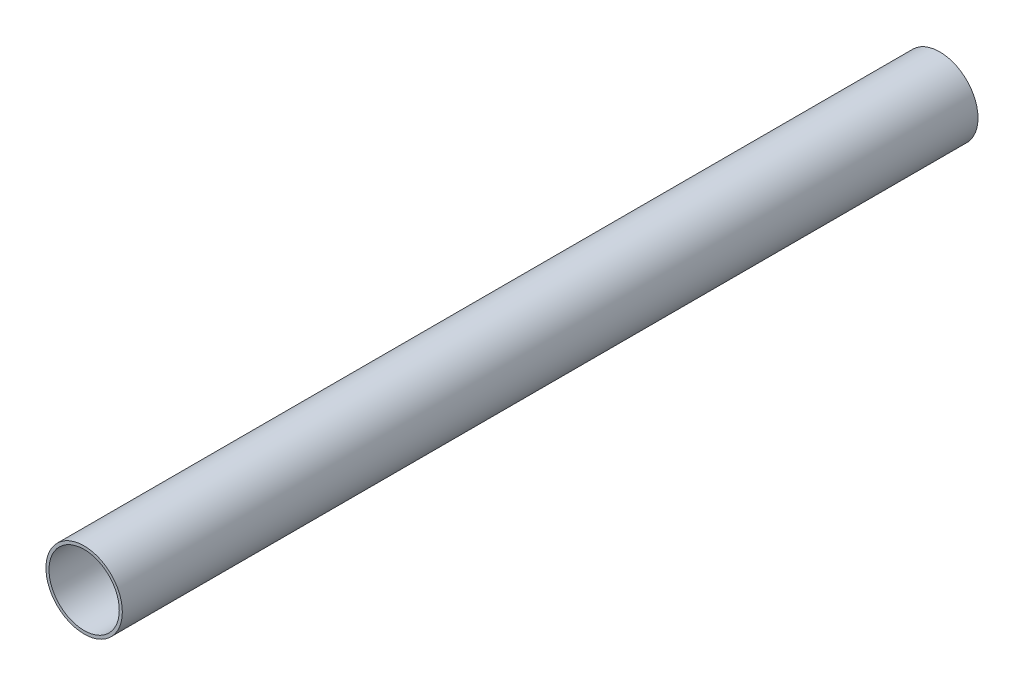
ISO-10303-21;
HEADER;
FILE_DESCRIPTION(('STEP AP214'),'2;1');
FILE_NAME('part.step','',(''),(''),'','','');
FILE_SCHEMA(('AUTOMOTIVE_DESIGN { 1 0 10303 214 1 1 1 1 }'));
ENDSEC;
DATA;
#1=APPLICATION_CONTEXT('core data for automotive mechanical design processes');
#2=APPLICATION_PROTOCOL_DEFINITION('international standard','automotive_design',2000,#1);
#3=PRODUCT_CONTEXT('',#1,'mechanical');
#4=PRODUCT('Part','Part','',(#3));
#5=PRODUCT_RELATED_PRODUCT_CATEGORY('part','',(#4));
#6=PRODUCT_DEFINITION_FORMATION('','',#4);
#7=PRODUCT_DEFINITION_CONTEXT('part definition',#1,'design');
#8=PRODUCT_DEFINITION('design','',#6,#7);
#9=PRODUCT_DEFINITION_SHAPE('','',#8);
#10=(LENGTH_UNIT() NAMED_UNIT(*) SI_UNIT(.MILLI.,.METRE.));
#11=(NAMED_UNIT(*) PLANE_ANGLE_UNIT() SI_UNIT($,.RADIAN.));
#12=(NAMED_UNIT(*) SI_UNIT($,.STERADIAN.) SOLID_ANGLE_UNIT());
#13=UNCERTAINTY_MEASURE_WITH_UNIT(LENGTH_MEASURE(1.E-05),#10,'distance_accuracy_value','');
#14=(GEOMETRIC_REPRESENTATION_CONTEXT(3) GLOBAL_UNCERTAINTY_ASSIGNED_CONTEXT((#13)) GLOBAL_UNIT_ASSIGNED_CONTEXT((#10,
#11,#12)) REPRESENTATION_CONTEXT('',''));
#15=CARTESIAN_POINT('',(0.,0.,0.));
#16=DIRECTION('',(0.,0.,1.));
#17=DIRECTION('',(1.,0.,0.));
#18=AXIS2_PLACEMENT_3D('',#15,#16,#17);
#19=CARTESIAN_POINT('',(0.,0.,280.));
#20=DIRECTION('',(0.,0.,1.));
#21=DIRECTION('',(1.,0.,0.));
#22=AXIS2_PLACEMENT_3D('',#19,#20,#21);
#23=PLANE('',#22);
#24=CARTESIAN_POINT('',(0.,0.,280.));
#25=DIRECTION('',(0.,0.,1.));
#26=DIRECTION('',(1.,0.,0.));
#27=AXIS2_PLACEMENT_3D('',#24,#25,#26);
#28=CIRCLE('',#27,12.5);
#29=CARTESIAN_POINT('',(12.5,0.,280.));
#30=VERTEX_POINT('',#29);
#31=EDGE_CURVE('E10',#30,#30,#28,.T.);
#32=ORIENTED_EDGE('',*,*,#31,.T.);
#33=EDGE_LOOP('',(#32));
#34=FACE_BOUND('',#33,.T.);
#35=CARTESIAN_POINT('',(0.,0.,280.));
#36=DIRECTION('',(0.,0.,1.));
#37=DIRECTION('',(1.,0.,0.));
#38=AXIS2_PLACEMENT_3D('',#35,#36,#37);
#39=CIRCLE('',#38,11.5);
#40=CARTESIAN_POINT('',(11.5,0.,280.));
#41=VERTEX_POINT('',#40);
#42=EDGE_CURVE('E43',#41,#41,#39,.T.);
#43=ORIENTED_EDGE('',*,*,#42,.F.);
#44=EDGE_LOOP('',(#43));
#45=FACE_BOUND('',#44,.T.);
#46=ADVANCED_FACE('F32',(#34,#45),#23,.T.);
#47=CARTESIAN_POINT('',(0.,0.,0.));
#48=DIRECTION('',(0.,0.,1.));
#49=DIRECTION('',(1.,0.,0.));
#50=AXIS2_PLACEMENT_3D('',#47,#48,#49);
#51=PLANE('',#50);
#52=CARTESIAN_POINT('',(0.,0.,0.));
#53=DIRECTION('',(0.,0.,1.));
#54=DIRECTION('',(1.,0.,0.));
#55=AXIS2_PLACEMENT_3D('',#52,#53,#54);
#56=CIRCLE('',#55,12.5);
#57=CARTESIAN_POINT('',(12.5,0.,0.));
#58=VERTEX_POINT('',#57);
#59=EDGE_CURVE('E39',#58,#58,#56,.T.);
#60=ORIENTED_EDGE('',*,*,#59,.F.);
#61=EDGE_LOOP('',(#60));
#62=FACE_BOUND('',#61,.T.);
#63=CARTESIAN_POINT('',(0.,0.,0.));
#64=DIRECTION('',(0.,0.,1.));
#65=DIRECTION('',(1.,0.,0.));
#66=AXIS2_PLACEMENT_3D('',#63,#64,#65);
#67=CIRCLE('',#66,11.5);
#68=CARTESIAN_POINT('',(11.5,0.,0.));
#69=VERTEX_POINT('',#68);
#70=EDGE_CURVE('E47',#69,#69,#67,.T.);
#71=ORIENTED_EDGE('',*,*,#70,.T.);
#72=EDGE_LOOP('',(#71));
#73=FACE_BOUND('',#72,.T.);
#74=ADVANCED_FACE('F56',(#62,#73),#51,.F.);
#75=CARTESIAN_POINT('',(0.,0.,280.));
#76=DIRECTION('',(0.,0.,-1.));
#77=DIRECTION('',(-1.,0.,0.));
#78=AXIS2_PLACEMENT_3D('',#75,#76,#77);
#79=CYLINDRICAL_SURFACE('',#78,12.5);
#80=ORIENTED_EDGE('',*,*,#31,.F.);
#81=EDGE_LOOP('',(#80));
#82=FACE_BOUND('',#81,.T.);
#83=ORIENTED_EDGE('',*,*,#59,.T.);
#84=EDGE_LOOP('',(#83));
#85=FACE_BOUND('',#84,.T.);
#86=ADVANCED_FACE('F34',(#82,#85),#79,.T.);
#87=CARTESIAN_POINT('',(0.,0.,280.));
#88=DIRECTION('',(0.,0.,-1.));
#89=DIRECTION('',(-1.,0.,0.));
#90=AXIS2_PLACEMENT_3D('',#87,#88,#89);
#91=CYLINDRICAL_SURFACE('',#90,11.5);
#92=ORIENTED_EDGE('',*,*,#42,.T.);
#93=EDGE_LOOP('',(#92));
#94=FACE_BOUND('',#93,.T.);
#95=ORIENTED_EDGE('',*,*,#70,.F.);
#96=EDGE_LOOP('',(#95));
#97=FACE_BOUND('',#96,.T.);
#98=ADVANCED_FACE('F58',(#94,#97),#91,.F.);
#99=CLOSED_SHELL('',(#46,#74,#86,#98));
#100=MANIFOLD_SOLID_BREP('B2',#99);
#101=ADVANCED_BREP_SHAPE_REPRESENTATION('',(#18,#100),#14);
#102=SHAPE_DEFINITION_REPRESENTATION(#9,#101);
ENDSEC;
END-ISO-10303-21;
